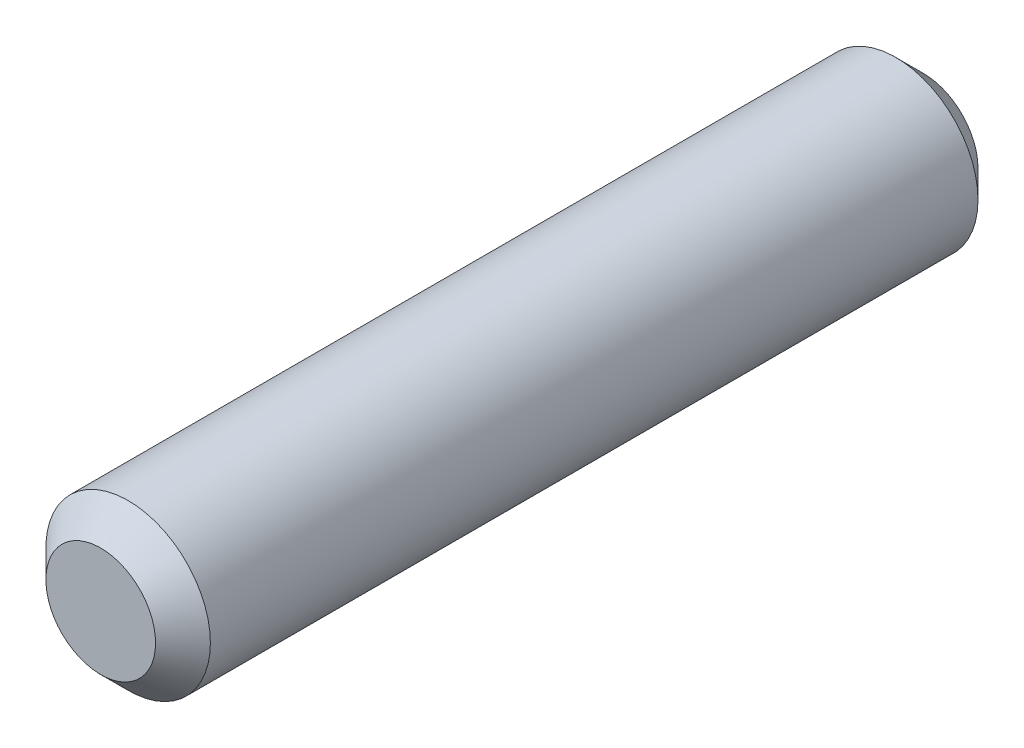
ISO-10303-21;
HEADER;
FILE_DESCRIPTION(('STEP AP214'),'2;1');
FILE_NAME('part.step','',(''),(''),'','','');
FILE_SCHEMA(('AUTOMOTIVE_DESIGN { 1 0 10303 214 1 1 1 1 }'));
ENDSEC;
DATA;
#1=APPLICATION_CONTEXT('core data for automotive mechanical design processes');
#2=APPLICATION_PROTOCOL_DEFINITION('international standard','automotive_design',2000,#1);
#3=PRODUCT_CONTEXT('',#1,'mechanical');
#4=PRODUCT('Part','Part','',(#3));
#5=PRODUCT_RELATED_PRODUCT_CATEGORY('part','',(#4));
#6=PRODUCT_DEFINITION_FORMATION('','',#4);
#7=PRODUCT_DEFINITION_CONTEXT('part definition',#1,'design');
#8=PRODUCT_DEFINITION('design','',#6,#7);
#9=PRODUCT_DEFINITION_SHAPE('','',#8);
#10=(LENGTH_UNIT() NAMED_UNIT(*) SI_UNIT(.MILLI.,.METRE.));
#11=(NAMED_UNIT(*) PLANE_ANGLE_UNIT() SI_UNIT($,.RADIAN.));
#12=(NAMED_UNIT(*) SI_UNIT($,.STERADIAN.) SOLID_ANGLE_UNIT());
#13=UNCERTAINTY_MEASURE_WITH_UNIT(LENGTH_MEASURE(1.E-05),#10,'distance_accuracy_value','');
#14=(GEOMETRIC_REPRESENTATION_CONTEXT(3) GLOBAL_UNCERTAINTY_ASSIGNED_CONTEXT((#13)) GLOBAL_UNIT_ASSIGNED_CONTEXT((#10,
#11,#12)) REPRESENTATION_CONTEXT('',''));
#15=CARTESIAN_POINT('',(0.,0.,0.));
#16=DIRECTION('',(0.,0.,1.));
#17=DIRECTION('',(1.,0.,0.));
#18=AXIS2_PLACEMENT_3D('',#15,#16,#17);
#19=CARTESIAN_POINT('',(0.,0.,15.));
#20=DIRECTION('',(0.,0.,-1.));
#21=DIRECTION('',(-1.,0.,0.));
#22=AXIS2_PLACEMENT_3D('',#19,#20,#21);
#23=CYLINDRICAL_SURFACE('',#22,1.5);
#24=CARTESIAN_POINT('',(0.,0.,14.5));
#25=DIRECTION('',(0.,0.,1.));
#26=DIRECTION('',(1.,0.,0.));
#27=AXIS2_PLACEMENT_3D('',#24,#25,#26);
#28=CIRCLE('',#27,1.5);
#29=CARTESIAN_POINT('',(1.5,0.,14.5));
#30=VERTEX_POINT('',#29);
#31=EDGE_CURVE('E39',#30,#30,#28,.F.);
#32=ORIENTED_EDGE('',*,*,#31,.T.);
#33=EDGE_LOOP('',(#32));
#34=FACE_BOUND('',#33,.T.);
#35=CARTESIAN_POINT('',(0.,0.,0.499999999999999));
#36=DIRECTION('',(0.,0.,1.));
#37=DIRECTION('',(1.,0.,0.));
#38=AXIS2_PLACEMENT_3D('',#35,#36,#37);
#39=CIRCLE('',#38,1.5);
#40=CARTESIAN_POINT('',(1.5,0.,0.499999999999999));
#41=VERTEX_POINT('',#40);
#42=EDGE_CURVE('E43',#41,#41,#39,.T.);
#43=ORIENTED_EDGE('',*,*,#42,.T.);
#44=EDGE_LOOP('',(#43));
#45=FACE_BOUND('',#44,.T.);
#46=ADVANCED_FACE('F32',(#34,#45),#23,.T.);
#47=CARTESIAN_POINT('',(0.,0.,15.));
#48=DIRECTION('',(0.,0.,1.));
#49=DIRECTION('',(1.,0.,0.));
#50=AXIS2_PLACEMENT_3D('',#47,#48,#49);
#51=PLANE('',#50);
#52=CARTESIAN_POINT('',(0.,0.,15.));
#53=DIRECTION('',(0.,0.,1.));
#54=DIRECTION('',(1.,0.,0.));
#55=AXIS2_PLACEMENT_3D('',#52,#53,#54);
#56=CIRCLE('',#55,1.);
#57=CARTESIAN_POINT('',(1.,0.,15.));
#58=VERTEX_POINT('',#57);
#59=EDGE_CURVE('E47',#58,#58,#56,.T.);
#60=ORIENTED_EDGE('',*,*,#59,.T.);
#61=EDGE_LOOP('',(#60));
#62=FACE_BOUND('',#61,.T.);
#63=ADVANCED_FACE('F53',(#62),#51,.T.);
#64=CARTESIAN_POINT('',(0.,0.,0.));
#65=DIRECTION('',(0.,0.,1.));
#66=DIRECTION('',(1.,0.,0.));
#67=AXIS2_PLACEMENT_3D('',#64,#65,#66);
#68=PLANE('',#67);
#69=CARTESIAN_POINT('',(0.,0.,0.));
#70=DIRECTION('',(0.,0.,1.));
#71=DIRECTION('',(1.,0.,0.));
#72=AXIS2_PLACEMENT_3D('',#69,#70,#71);
#73=CIRCLE('',#72,0.999999999999999);
#74=CARTESIAN_POINT('',(0.999999999999999,0.,0.));
#75=VERTEX_POINT('',#74);
#76=EDGE_CURVE('E10',#75,#75,#73,.F.);
#77=ORIENTED_EDGE('',*,*,#76,.T.);
#78=EDGE_LOOP('',(#77));
#79=FACE_BOUND('',#78,.T.);
#80=ADVANCED_FACE('F57',(#79),#68,.F.);
#81=CARTESIAN_POINT('',(0.,0.,15.));
#82=DIRECTION('',(0.,0.,-1.));
#83=DIRECTION('',(-1.,0.,0.));
#84=AXIS2_PLACEMENT_3D('',#81,#82,#83);
#85=CONICAL_SURFACE('',#84,1.,0.785398163397443);
#86=ORIENTED_EDGE('',*,*,#31,.F.);
#87=EDGE_LOOP('',(#86));
#88=FACE_BOUND('',#87,.T.);
#89=ORIENTED_EDGE('',*,*,#59,.F.);
#90=EDGE_LOOP('',(#89));
#91=FACE_BOUND('',#90,.T.);
#92=ADVANCED_FACE('F55',(#88,#91),#85,.T.);
#93=CARTESIAN_POINT('',(0.,0.,0.499999999999999));
#94=DIRECTION('',(0.,0.,1.));
#95=DIRECTION('',(1.,0.,0.));
#96=AXIS2_PLACEMENT_3D('',#93,#94,#95);
#97=CONICAL_SURFACE('',#96,1.5,0.78539816339745);
#98=ORIENTED_EDGE('',*,*,#76,.F.);
#99=EDGE_LOOP('',(#98));
#100=FACE_BOUND('',#99,.T.);
#101=ORIENTED_EDGE('',*,*,#42,.F.);
#102=EDGE_LOOP('',(#101));
#103=FACE_BOUND('',#102,.T.);
#104=ADVANCED_FACE('F34',(#100,#103),#97,.T.);
#105=CLOSED_SHELL('',(#46,#63,#80,#92,#104));
#106=MANIFOLD_SOLID_BREP('B2',#105);
#107=ADVANCED_BREP_SHAPE_REPRESENTATION('',(#18,#106),#14);
#108=SHAPE_DEFINITION_REPRESENTATION(#9,#107);
ENDSEC;
END-ISO-10303-21;
